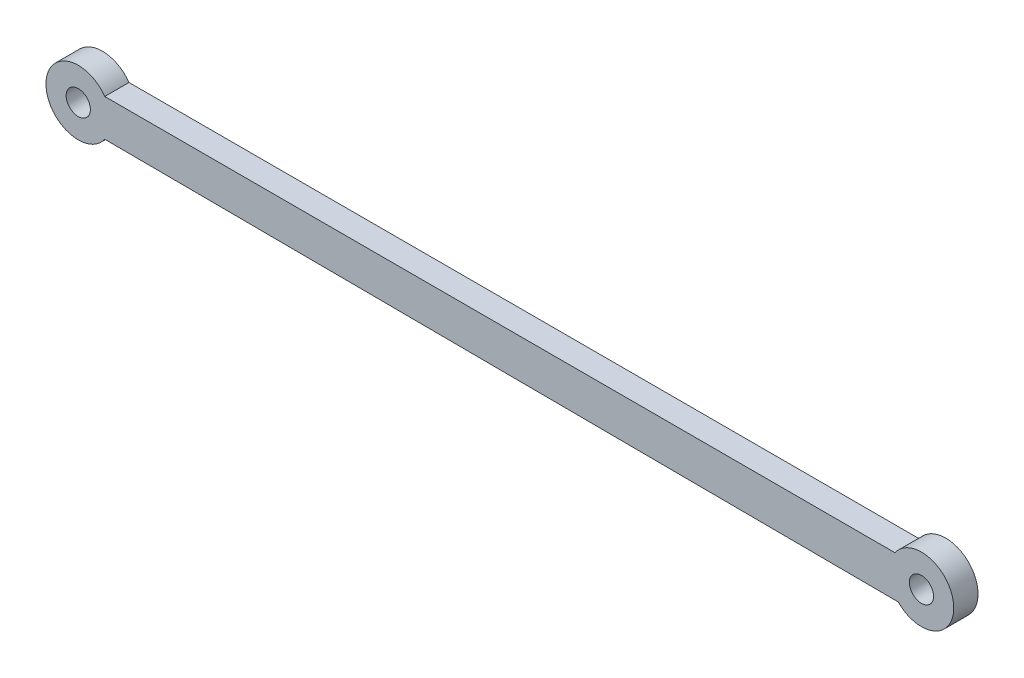
ISO-10303-21;
HEADER;
FILE_DESCRIPTION(('STEP AP214'),'2;1');
FILE_NAME('part.step','',(''),(''),'','','');
FILE_SCHEMA(('AUTOMOTIVE_DESIGN { 1 0 10303 214 1 1 1 1 }'));
ENDSEC;
DATA;
#1=APPLICATION_CONTEXT('core data for automotive mechanical design processes');
#2=APPLICATION_PROTOCOL_DEFINITION('international standard','automotive_design',2000,#1);
#3=PRODUCT_CONTEXT('',#1,'mechanical');
#4=PRODUCT('Part','Part','',(#3));
#5=PRODUCT_RELATED_PRODUCT_CATEGORY('part','',(#4));
#6=PRODUCT_DEFINITION_FORMATION('','',#4);
#7=PRODUCT_DEFINITION_CONTEXT('part definition',#1,'design');
#8=PRODUCT_DEFINITION('design','',#6,#7);
#9=PRODUCT_DEFINITION_SHAPE('','',#8);
#10=(LENGTH_UNIT() NAMED_UNIT(*) SI_UNIT(.MILLI.,.METRE.));
#11=(NAMED_UNIT(*) PLANE_ANGLE_UNIT() SI_UNIT($,.RADIAN.));
#12=(NAMED_UNIT(*) SI_UNIT($,.STERADIAN.) SOLID_ANGLE_UNIT());
#13=UNCERTAINTY_MEASURE_WITH_UNIT(LENGTH_MEASURE(1.E-05),#10,'distance_accuracy_value','');
#14=(GEOMETRIC_REPRESENTATION_CONTEXT(3) GLOBAL_UNCERTAINTY_ASSIGNED_CONTEXT((#13)) GLOBAL_UNIT_ASSIGNED_CONTEXT((#10,
#11,#12)) REPRESENTATION_CONTEXT('',''));
#15=CARTESIAN_POINT('',(0.,0.,0.));
#16=DIRECTION('',(0.,0.,1.));
#17=DIRECTION('',(1.,0.,0.));
#18=AXIS2_PLACEMENT_3D('',#15,#16,#17);
#19=CARTESIAN_POINT('',(0.,0.,3.));
#20=DIRECTION('',(0.,0.,1.));
#21=DIRECTION('',(1.,0.,0.));
#22=AXIS2_PLACEMENT_3D('',#19,#20,#21);
#23=PLANE('',#22);
#24=CARTESIAN_POINT('',(0.,0.,3.));
#25=DIRECTION('',(0.,0.,1.));
#26=DIRECTION('',(1.,0.,0.));
#27=AXIS2_PLACEMENT_3D('',#24,#25,#26);
#28=CIRCLE('',#27,1.5);
#29=CARTESIAN_POINT('',(1.5,0.,3.));
#30=VERTEX_POINT('',#29);
#31=EDGE_CURVE('E112',#30,#30,#28,.T.);
#32=ORIENTED_EDGE('',*,*,#31,.F.);
#33=EDGE_LOOP('',(#32));
#34=FACE_BOUND('',#33,.T.);
#35=CARTESIAN_POINT('',(0.,0.,3.));
#36=DIRECTION('',(0.,0.,1.));
#37=DIRECTION('',(1.,0.,0.));
#38=AXIS2_PLACEMENT_3D('',#35,#36,#37);
#39=CIRCLE('',#38,4.);
#40=CARTESIAN_POINT('',(3.27761569740017,2.29286618452887,3.));
#41=VERTEX_POINT('',#40);
#42=CARTESIAN_POINT('',(3.27761569740017,-2.29286618452887,3.));
#43=VERTEX_POINT('',#42);
#44=EDGE_CURVE('E92',#41,#43,#39,.T.);
#45=ORIENTED_EDGE('',*,*,#44,.T.);
#46=DIRECTION('',(0.99998755706195,-0.00498855903778245,0.));
#47=VECTOR('',#46,1.);
#48=CARTESIAN_POINT('',(3.27761569740017,-2.29286618452887,3.));
#49=LINE('',#48,#47);
#50=CARTESIAN_POINT('',(101.456518667037,-2.78264353252682,3.));
#51=VERTEX_POINT('',#50);
#52=EDGE_CURVE('E87',#43,#51,#49,.T.);
#53=ORIENTED_EDGE('',*,*,#52,.T.);
#54=CARTESIAN_POINT('',(104.33,0.,3.));
#55=DIRECTION('',(0.,0.,1.));
#56=DIRECTION('',(1.,0.,0.));
#57=AXIS2_PLACEMENT_3D('',#54,#55,#56);
#58=CIRCLE('',#57,4.00000000000001);
#59=CARTESIAN_POINT('',(101.0523843026,2.29286618452887,3.));
#60=VERTEX_POINT('',#59);
#61=EDGE_CURVE('E90',#51,#60,#58,.T.);
#62=ORIENTED_EDGE('',*,*,#61,.T.);
#63=DIRECTION('',(-1.,0.,0.));
#64=VECTOR('',#63,1.);
#65=CARTESIAN_POINT('',(3.27761569740017,2.29286618452887,3.));
#66=LINE('',#65,#64);
#67=EDGE_CURVE('E57',#60,#41,#66,.T.);
#68=ORIENTED_EDGE('',*,*,#67,.T.);
#69=EDGE_LOOP('',(#45,#53,#62,#68));
#70=FACE_BOUND('',#69,.T.);
#71=CARTESIAN_POINT('',(104.33,0.,3.));
#72=DIRECTION('',(0.,0.,1.));
#73=DIRECTION('',(1.,0.,0.));
#74=AXIS2_PLACEMENT_3D('',#71,#72,#73);
#75=CIRCLE('',#74,1.5);
#76=CARTESIAN_POINT('',(105.83,0.,3.));
#77=VERTEX_POINT('',#76);
#78=EDGE_CURVE('E134',#77,#77,#75,.T.);
#79=ORIENTED_EDGE('',*,*,#78,.F.);
#80=EDGE_LOOP('',(#79));
#81=FACE_BOUND('',#80,.T.);
#82=ADVANCED_FACE('F39',(#34,#70,#81),#23,.T.);
#83=CARTESIAN_POINT('',(0.,0.,0.));
#84=DIRECTION('',(0.,0.,1.));
#85=DIRECTION('',(1.,0.,0.));
#86=AXIS2_PLACEMENT_3D('',#83,#84,#85);
#87=PLANE('',#86);
#88=CARTESIAN_POINT('',(0.,0.,0.));
#89=DIRECTION('',(0.,0.,1.));
#90=DIRECTION('',(1.,0.,0.));
#91=AXIS2_PLACEMENT_3D('',#88,#89,#90);
#92=CIRCLE('',#91,4.);
#93=CARTESIAN_POINT('',(3.27761569740017,2.29286618452887,0.));
#94=VERTEX_POINT('',#93);
#95=CARTESIAN_POINT('',(3.27761569740017,-2.29286618452887,0.));
#96=VERTEX_POINT('',#95);
#97=EDGE_CURVE('E108',#94,#96,#92,.T.);
#98=ORIENTED_EDGE('',*,*,#97,.F.);
#99=DIRECTION('',(-1.,0.,0.));
#100=VECTOR('',#99,1.);
#101=CARTESIAN_POINT('',(3.27761569740017,2.29286618452887,0.));
#102=LINE('',#101,#100);
#103=CARTESIAN_POINT('',(101.0523843026,2.29286618452887,0.));
#104=VERTEX_POINT('',#103);
#105=EDGE_CURVE('E80',#104,#94,#102,.T.);
#106=ORIENTED_EDGE('',*,*,#105,.F.);
#107=CARTESIAN_POINT('',(104.33,0.,0.));
#108=DIRECTION('',(0.,0.,1.));
#109=DIRECTION('',(1.,0.,0.));
#110=AXIS2_PLACEMENT_3D('',#107,#108,#109);
#111=CIRCLE('',#110,4.00000000000001);
#112=CARTESIAN_POINT('',(101.456518667037,-2.78264353252682,0.));
#113=VERTEX_POINT('',#112);
#114=EDGE_CURVE('E74',#113,#104,#111,.T.);
#115=ORIENTED_EDGE('',*,*,#114,.F.);
#116=DIRECTION('',(0.99998755706195,-0.00498855903778245,0.));
#117=VECTOR('',#116,1.);
#118=CARTESIAN_POINT('',(3.27761569740017,-2.29286618452887,0.));
#119=LINE('',#118,#117);
#120=EDGE_CURVE('E97',#96,#113,#119,.T.);
#121=ORIENTED_EDGE('',*,*,#120,.F.);
#122=EDGE_LOOP('',(#98,#106,#115,#121));
#123=FACE_BOUND('',#122,.T.);
#124=CARTESIAN_POINT('',(0.,0.,0.));
#125=DIRECTION('',(0.,0.,1.));
#126=DIRECTION('',(1.,0.,0.));
#127=AXIS2_PLACEMENT_3D('',#124,#125,#126);
#128=CIRCLE('',#127,1.5);
#129=CARTESIAN_POINT('',(1.5,0.,0.));
#130=VERTEX_POINT('',#129);
#131=EDGE_CURVE('E130',#130,#130,#128,.T.);
#132=ORIENTED_EDGE('',*,*,#131,.T.);
#133=EDGE_LOOP('',(#132));
#134=FACE_BOUND('',#133,.T.);
#135=CARTESIAN_POINT('',(104.33,0.,0.));
#136=DIRECTION('',(0.,0.,1.));
#137=DIRECTION('',(1.,0.,0.));
#138=AXIS2_PLACEMENT_3D('',#135,#136,#137);
#139=CIRCLE('',#138,1.5);
#140=CARTESIAN_POINT('',(105.83,0.,0.));
#141=VERTEX_POINT('',#140);
#142=EDGE_CURVE('E138',#141,#141,#139,.T.);
#143=ORIENTED_EDGE('',*,*,#142,.T.);
#144=EDGE_LOOP('',(#143));
#145=FACE_BOUND('',#144,.T.);
#146=ADVANCED_FACE('F125',(#123,#134,#145),#87,.F.);
#147=CARTESIAN_POINT('',(0.,0.,3.));
#148=DIRECTION('',(0.,0.,-1.));
#149=DIRECTION('',(-1.,0.,0.));
#150=AXIS2_PLACEMENT_3D('',#147,#148,#149);
#151=CYLINDRICAL_SURFACE('',#150,4.);
#152=ORIENTED_EDGE('',*,*,#97,.T.);
#153=DIRECTION('',(0.,0.,-1.));
#154=VECTOR('',#153,1.);
#155=CARTESIAN_POINT('',(3.27761569740017,-2.29286618452887,3.));
#156=LINE('',#155,#154);
#157=EDGE_CURVE('E11',#43,#96,#156,.T.);
#158=ORIENTED_EDGE('',*,*,#157,.F.);
#159=ORIENTED_EDGE('',*,*,#44,.F.);
#160=DIRECTION('',(0.,0.,-1.));
#161=VECTOR('',#160,1.);
#162=CARTESIAN_POINT('',(3.27761569740017,2.29286618452887,3.));
#163=LINE('',#162,#161);
#164=EDGE_CURVE('E104',#41,#94,#163,.T.);
#165=ORIENTED_EDGE('',*,*,#164,.T.);
#166=EDGE_LOOP('',(#152,#158,#159,#165));
#167=FACE_BOUND('',#166,.T.);
#168=ADVANCED_FACE('F41',(#167),#151,.T.);
#169=CARTESIAN_POINT('',(3.27761569740017,-2.29286618452887,3.));
#170=DIRECTION('',(0.00498855903778245,0.99998755706195,0.));
#171=DIRECTION('',(-0.99998755706195,0.00498855903778245,0.));
#172=AXIS2_PLACEMENT_3D('',#169,#170,#171);
#173=PLANE('',#172);
#174=ORIENTED_EDGE('',*,*,#120,.T.);
#175=DIRECTION('',(0.,0.,-1.));
#176=VECTOR('',#175,1.);
#177=CARTESIAN_POINT('',(101.456518667037,-2.78264353252682,3.));
#178=LINE('',#177,#176);
#179=EDGE_CURVE('E49',#51,#113,#178,.T.);
#180=ORIENTED_EDGE('',*,*,#179,.F.);
#181=ORIENTED_EDGE('',*,*,#52,.F.);
#182=ORIENTED_EDGE('',*,*,#157,.T.);
#183=EDGE_LOOP('',(#174,#180,#181,#182));
#184=FACE_BOUND('',#183,.T.);
#185=ADVANCED_FACE('F96',(#184),#173,.F.);
#186=CARTESIAN_POINT('',(104.33,0.,3.));
#187=DIRECTION('',(0.,0.,-1.));
#188=DIRECTION('',(-1.,0.,0.));
#189=AXIS2_PLACEMENT_3D('',#186,#187,#188);
#190=CYLINDRICAL_SURFACE('',#189,4.00000000000001);
#191=ORIENTED_EDGE('',*,*,#114,.T.);
#192=DIRECTION('',(0.,0.,-1.));
#193=VECTOR('',#192,1.);
#194=CARTESIAN_POINT('',(101.0523843026,2.29286618452887,3.));
#195=LINE('',#194,#193);
#196=EDGE_CURVE('E99',#60,#104,#195,.T.);
#197=ORIENTED_EDGE('',*,*,#196,.F.);
#198=ORIENTED_EDGE('',*,*,#61,.F.);
#199=ORIENTED_EDGE('',*,*,#179,.T.);
#200=EDGE_LOOP('',(#191,#197,#198,#199));
#201=FACE_BOUND('',#200,.T.);
#202=ADVANCED_FACE('F100',(#201),#190,.T.);
#203=CARTESIAN_POINT('',(3.27761569740017,2.29286618452887,3.));
#204=DIRECTION('',(0.,-1.,0.));
#205=DIRECTION('',(0.,0.,-1.));
#206=AXIS2_PLACEMENT_3D('',#203,#204,#205);
#207=PLANE('',#206);
#208=ORIENTED_EDGE('',*,*,#105,.T.);
#209=ORIENTED_EDGE('',*,*,#164,.F.);
#210=ORIENTED_EDGE('',*,*,#67,.F.);
#211=ORIENTED_EDGE('',*,*,#196,.T.);
#212=EDGE_LOOP('',(#208,#209,#210,#211));
#213=FACE_BOUND('',#212,.T.);
#214=ADVANCED_FACE('F122',(#213),#207,.F.);
#215=CARTESIAN_POINT('',(0.,0.,3.));
#216=DIRECTION('',(0.,0.,-1.));
#217=DIRECTION('',(-1.,0.,0.));
#218=AXIS2_PLACEMENT_3D('',#215,#216,#217);
#219=CYLINDRICAL_SURFACE('',#218,1.5);
#220=ORIENTED_EDGE('',*,*,#31,.T.);
#221=EDGE_LOOP('',(#220));
#222=FACE_BOUND('',#221,.T.);
#223=ORIENTED_EDGE('',*,*,#131,.F.);
#224=EDGE_LOOP('',(#223));
#225=FACE_BOUND('',#224,.T.);
#226=ADVANCED_FACE('F157',(#222,#225),#219,.F.);
#227=CARTESIAN_POINT('',(104.33,0.,3.));
#228=DIRECTION('',(0.,0.,-1.));
#229=DIRECTION('',(-1.,0.,0.));
#230=AXIS2_PLACEMENT_3D('',#227,#228,#229);
#231=CYLINDRICAL_SURFACE('',#230,1.5);
#232=ORIENTED_EDGE('',*,*,#78,.T.);
#233=EDGE_LOOP('',(#232));
#234=FACE_BOUND('',#233,.T.);
#235=ORIENTED_EDGE('',*,*,#142,.F.);
#236=EDGE_LOOP('',(#235));
#237=FACE_BOUND('',#236,.T.);
#238=ADVANCED_FACE('F146',(#234,#237),#231,.F.);
#239=CLOSED_SHELL('',(#82,#146,#168,#185,#202,#214,#226,#238));
#240=MANIFOLD_SOLID_BREP('B2',#239);
#241=ADVANCED_BREP_SHAPE_REPRESENTATION('',(#18,#240),#14);
#242=SHAPE_DEFINITION_REPRESENTATION(#9,#241);
ENDSEC;
END-ISO-10303-21;
